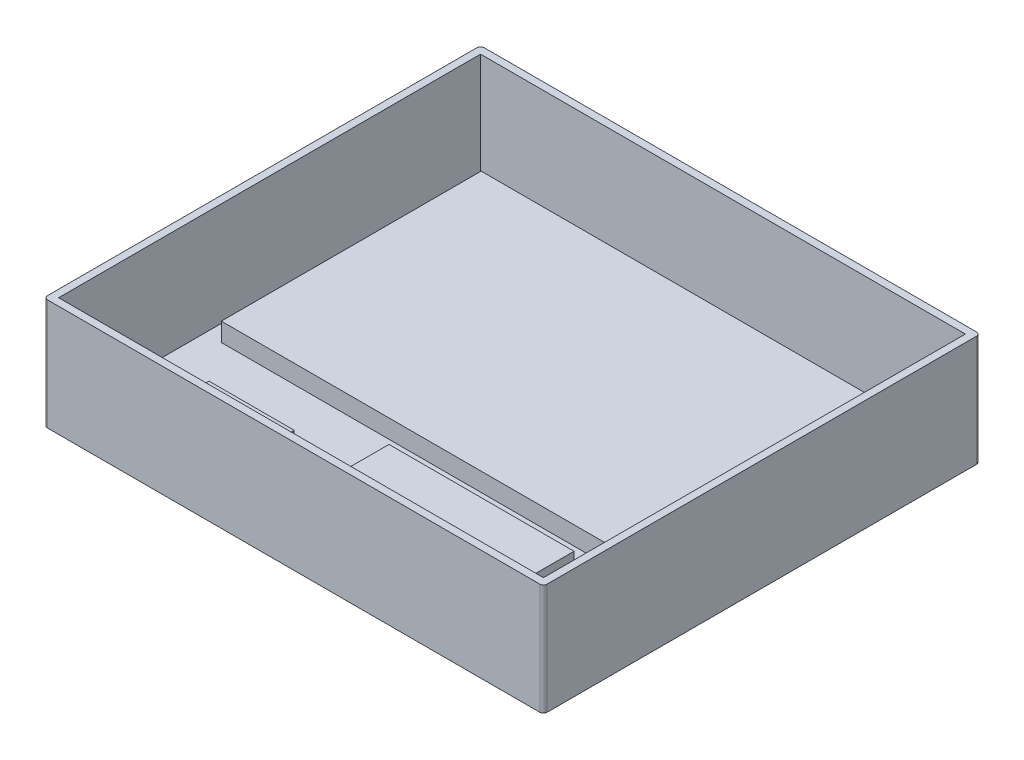
ISO-10303-21;
HEADER;
FILE_DESCRIPTION(('STEP AP214'),'2;1');
FILE_NAME('part.step','',(''),(''),'','','');
FILE_SCHEMA(('AUTOMOTIVE_DESIGN { 1 0 10303 214 1 1 1 1 }'));
ENDSEC;
DATA;
#1=APPLICATION_CONTEXT('core data for automotive mechanical design processes');
#2=APPLICATION_PROTOCOL_DEFINITION('international standard','automotive_design',2000,#1);
#3=PRODUCT_CONTEXT('',#1,'mechanical');
#4=PRODUCT('Part','Part','',(#3));
#5=PRODUCT_RELATED_PRODUCT_CATEGORY('part','',(#4));
#6=PRODUCT_DEFINITION_FORMATION('','',#4);
#7=PRODUCT_DEFINITION_CONTEXT('part definition',#1,'design');
#8=PRODUCT_DEFINITION('design','',#6,#7);
#9=PRODUCT_DEFINITION_SHAPE('','',#8);
#10=(LENGTH_UNIT() NAMED_UNIT(*) SI_UNIT(.MILLI.,.METRE.));
#11=(NAMED_UNIT(*) PLANE_ANGLE_UNIT() SI_UNIT($,.RADIAN.));
#12=(NAMED_UNIT(*) SI_UNIT($,.STERADIAN.) SOLID_ANGLE_UNIT());
#13=UNCERTAINTY_MEASURE_WITH_UNIT(LENGTH_MEASURE(1.E-05),#10,'distance_accuracy_value','');
#14=(GEOMETRIC_REPRESENTATION_CONTEXT(3) GLOBAL_UNCERTAINTY_ASSIGNED_CONTEXT((#13)) GLOBAL_UNIT_ASSIGNED_CONTEXT((#10,
#11,#12)) REPRESENTATION_CONTEXT('',''));
#15=CARTESIAN_POINT('',(0.,0.,0.));
#16=DIRECTION('',(0.,0.,1.));
#17=DIRECTION('',(1.,0.,0.));
#18=AXIS2_PLACEMENT_3D('',#15,#16,#17);
#19=CARTESIAN_POINT('',(-66.5,30.,-58.));
#20=DIRECTION('',(0.,-1.,0.));
#21=DIRECTION('',(0.,0.,-1.));
#22=AXIS2_PLACEMENT_3D('',#19,#20,#21);
#23=CYLINDRICAL_SURFACE('',#22,1.);
#24=DIRECTION('',(0.,-1.,0.));
#25=VECTOR('',#24,1.);
#26=CARTESIAN_POINT('',(-67.5,30.,-58.));
#27=LINE('',#26,#25);
#28=CARTESIAN_POINT('',(-67.5,30.,-58.));
#29=VERTEX_POINT('',#28);
#30=CARTESIAN_POINT('',(-67.5,0.,-58.));
#31=VERTEX_POINT('',#30);
#32=EDGE_CURVE('E443',#29,#31,#27,.T.);
#33=ORIENTED_EDGE('',*,*,#32,.F.);
#34=CARTESIAN_POINT('',(-66.5,30.,-58.));
#35=DIRECTION('',(0.,1.,0.));
#36=DIRECTION('',(0.,0.,1.));
#37=AXIS2_PLACEMENT_3D('',#34,#35,#36);
#38=CIRCLE('',#37,1.);
#39=CARTESIAN_POINT('',(-66.5,30.,-59.));
#40=VERTEX_POINT('',#39);
#41=EDGE_CURVE('E53',#40,#29,#38,.T.);
#42=ORIENTED_EDGE('',*,*,#41,.F.);
#43=DIRECTION('',(0.,-1.,0.));
#44=VECTOR('',#43,1.);
#45=CARTESIAN_POINT('',(-66.5,30.,-59.));
#46=LINE('',#45,#44);
#47=CARTESIAN_POINT('',(-66.5,0.,-59.));
#48=VERTEX_POINT('',#47);
#49=EDGE_CURVE('E447',#48,#40,#46,.F.);
#50=ORIENTED_EDGE('',*,*,#49,.F.);
#51=CARTESIAN_POINT('',(-66.5,0.,-58.));
#52=DIRECTION('',(0.,1.,0.));
#53=DIRECTION('',(0.,0.,1.));
#54=AXIS2_PLACEMENT_3D('',#51,#52,#53);
#55=CIRCLE('',#54,1.);
#56=EDGE_CURVE('E12',#31,#48,#55,.F.);
#57=ORIENTED_EDGE('',*,*,#56,.F.);
#58=EDGE_LOOP('',(#33,#42,#50,#57));
#59=FACE_BOUND('',#58,.T.);
#60=ADVANCED_FACE('F45',(#59),#23,.T.);
#61=CARTESIAN_POINT('',(66.5,30.,-58.));
#62=DIRECTION('',(0.,-1.,0.));
#63=DIRECTION('',(0.,0.,-1.));
#64=AXIS2_PLACEMENT_3D('',#61,#62,#63);
#65=CYLINDRICAL_SURFACE('',#64,1.);
#66=DIRECTION('',(0.,-1.,0.));
#67=VECTOR('',#66,1.);
#68=CARTESIAN_POINT('',(66.5,30.,-59.));
#69=LINE('',#68,#67);
#70=CARTESIAN_POINT('',(66.5,30.,-59.));
#71=VERTEX_POINT('',#70);
#72=CARTESIAN_POINT('',(66.5,0.,-59.));
#73=VERTEX_POINT('',#72);
#74=EDGE_CURVE('E429',#71,#73,#69,.T.);
#75=ORIENTED_EDGE('',*,*,#74,.F.);
#76=CARTESIAN_POINT('',(66.5,30.,-58.));
#77=DIRECTION('',(0.,1.,0.));
#78=DIRECTION('',(0.,0.,1.));
#79=AXIS2_PLACEMENT_3D('',#76,#77,#78);
#80=CIRCLE('',#79,1.);
#81=CARTESIAN_POINT('',(67.5,30.,-58.));
#82=VERTEX_POINT('',#81);
#83=EDGE_CURVE('E437',#82,#71,#80,.T.);
#84=ORIENTED_EDGE('',*,*,#83,.F.);
#85=DIRECTION('',(0.,-1.,0.));
#86=VECTOR('',#85,1.);
#87=CARTESIAN_POINT('',(67.5,30.,-58.));
#88=LINE('',#87,#86);
#89=CARTESIAN_POINT('',(67.5,0.,-58.));
#90=VERTEX_POINT('',#89);
#91=EDGE_CURVE('E433',#90,#82,#88,.F.);
#92=ORIENTED_EDGE('',*,*,#91,.F.);
#93=CARTESIAN_POINT('',(66.5,0.,-58.));
#94=DIRECTION('',(0.,1.,0.));
#95=DIRECTION('',(0.,0.,1.));
#96=AXIS2_PLACEMENT_3D('',#93,#94,#95);
#97=CIRCLE('',#96,1.);
#98=EDGE_CURVE('E440',#73,#90,#97,.F.);
#99=ORIENTED_EDGE('',*,*,#98,.F.);
#100=EDGE_LOOP('',(#75,#84,#92,#99));
#101=FACE_BOUND('',#100,.T.);
#102=ADVANCED_FACE('F476',(#101),#65,.T.);
#103=CARTESIAN_POINT('',(66.5,30.,58.));
#104=DIRECTION('',(0.,1.,0.));
#105=DIRECTION('',(0.,0.,1.));
#106=AXIS2_PLACEMENT_3D('',#103,#104,#105);
#107=CYLINDRICAL_SURFACE('',#106,1.);
#108=DIRECTION('',(0.,1.,0.));
#109=VECTOR('',#108,1.);
#110=CARTESIAN_POINT('',(66.5,30.,59.));
#111=LINE('',#110,#109);
#112=CARTESIAN_POINT('',(66.5,0.,59.));
#113=VERTEX_POINT('',#112);
#114=CARTESIAN_POINT('',(66.5,30.,59.));
#115=VERTEX_POINT('',#114);
#116=EDGE_CURVE('E415',#113,#115,#111,.T.);
#117=ORIENTED_EDGE('',*,*,#116,.F.);
#118=CARTESIAN_POINT('',(66.5,0.,58.));
#119=DIRECTION('',(0.,1.,0.));
#120=DIRECTION('',(0.,0.,1.));
#121=AXIS2_PLACEMENT_3D('',#118,#119,#120);
#122=CIRCLE('',#121,1.);
#123=CARTESIAN_POINT('',(67.5,0.,58.));
#124=VERTEX_POINT('',#123);
#125=EDGE_CURVE('E423',#124,#113,#122,.F.);
#126=ORIENTED_EDGE('',*,*,#125,.F.);
#127=DIRECTION('',(0.,1.,0.));
#128=VECTOR('',#127,1.);
#129=CARTESIAN_POINT('',(67.5,30.,58.));
#130=LINE('',#129,#128);
#131=CARTESIAN_POINT('',(67.5,30.,58.));
#132=VERTEX_POINT('',#131);
#133=EDGE_CURVE('E419',#132,#124,#130,.F.);
#134=ORIENTED_EDGE('',*,*,#133,.F.);
#135=CARTESIAN_POINT('',(66.5,30.,58.));
#136=DIRECTION('',(0.,1.,0.));
#137=DIRECTION('',(0.,0.,1.));
#138=AXIS2_PLACEMENT_3D('',#135,#136,#137);
#139=CIRCLE('',#138,1.);
#140=EDGE_CURVE('E426',#115,#132,#139,.T.);
#141=ORIENTED_EDGE('',*,*,#140,.F.);
#142=EDGE_LOOP('',(#117,#126,#134,#141));
#143=FACE_BOUND('',#142,.T.);
#144=ADVANCED_FACE('F468',(#143),#107,.T.);
#145=CARTESIAN_POINT('',(-66.5,30.,58.));
#146=DIRECTION('',(0.,1.,0.));
#147=DIRECTION('',(0.,0.,1.));
#148=AXIS2_PLACEMENT_3D('',#145,#146,#147);
#149=CYLINDRICAL_SURFACE('',#148,1.);
#150=DIRECTION('',(0.,1.,0.));
#151=VECTOR('',#150,1.);
#152=CARTESIAN_POINT('',(-67.5,30.,58.));
#153=LINE('',#152,#151);
#154=CARTESIAN_POINT('',(-67.5,0.,58.));
#155=VERTEX_POINT('',#154);
#156=CARTESIAN_POINT('',(-67.5,30.,58.));
#157=VERTEX_POINT('',#156);
#158=EDGE_CURVE('E387',#155,#157,#153,.T.);
#159=ORIENTED_EDGE('',*,*,#158,.F.);
#160=CARTESIAN_POINT('',(-66.5,0.,58.));
#161=DIRECTION('',(0.,1.,0.));
#162=DIRECTION('',(0.,0.,1.));
#163=AXIS2_PLACEMENT_3D('',#160,#161,#162);
#164=CIRCLE('',#163,1.);
#165=CARTESIAN_POINT('',(-66.5,0.,59.));
#166=VERTEX_POINT('',#165);
#167=EDGE_CURVE('E408',#166,#155,#164,.F.);
#168=ORIENTED_EDGE('',*,*,#167,.F.);
#169=DIRECTION('',(0.,1.,0.));
#170=VECTOR('',#169,1.);
#171=CARTESIAN_POINT('',(-66.5,30.,59.));
#172=LINE('',#171,#170);
#173=CARTESIAN_POINT('',(-66.5,30.,59.));
#174=VERTEX_POINT('',#173);
#175=EDGE_CURVE('E404',#174,#166,#172,.F.);
#176=ORIENTED_EDGE('',*,*,#175,.F.);
#177=CARTESIAN_POINT('',(-66.5,30.,58.));
#178=DIRECTION('',(0.,1.,0.));
#179=DIRECTION('',(0.,0.,1.));
#180=AXIS2_PLACEMENT_3D('',#177,#178,#179);
#181=CIRCLE('',#180,1.);
#182=EDGE_CURVE('E412',#157,#174,#181,.T.);
#183=ORIENTED_EDGE('',*,*,#182,.F.);
#184=EDGE_LOOP('',(#159,#168,#176,#183));
#185=FACE_BOUND('',#184,.T.);
#186=ADVANCED_FACE('F459',(#185),#149,.T.);
#187=CARTESIAN_POINT('',(0.,2.,0.));
#188=DIRECTION('',(0.,1.,0.));
#189=DIRECTION('',(0.,0.,1.));
#190=AXIS2_PLACEMENT_3D('',#187,#188,#189);
#191=PLANE('',#190);
#192=DIRECTION('',(0.,0.,-1.));
#193=VECTOR('',#192,1.);
#194=CARTESIAN_POINT('',(-65.5,2.,-57.));
#195=LINE('',#194,#193);
#196=CARTESIAN_POINT('',(-65.5,2.,57.));
#197=VERTEX_POINT('',#196);
#198=CARTESIAN_POINT('',(-65.5,2.,-57.));
#199=VERTEX_POINT('',#198);
#200=EDGE_CURVE('E338',#197,#199,#195,.T.);
#201=ORIENTED_EDGE('',*,*,#200,.F.);
#202=DIRECTION('',(-1.,0.,0.));
#203=VECTOR('',#202,1.);
#204=CARTESIAN_POINT('',(-65.5,2.,57.));
#205=LINE('',#204,#203);
#206=CARTESIAN_POINT('',(65.5,1.99999999999995,57.));
#207=VERTEX_POINT('',#206);
#208=EDGE_CURVE('E341',#207,#197,#205,.T.);
#209=ORIENTED_EDGE('',*,*,#208,.F.);
#210=DIRECTION('',(0.,0.,1.));
#211=VECTOR('',#210,1.);
#212=CARTESIAN_POINT('',(65.5,2.,-57.));
#213=LINE('',#212,#211);
#214=CARTESIAN_POINT('',(65.5,2.,-57.));
#215=VERTEX_POINT('',#214);
#216=EDGE_CURVE('E331',#215,#207,#213,.T.);
#217=ORIENTED_EDGE('',*,*,#216,.F.);
#218=DIRECTION('',(1.,0.,0.));
#219=VECTOR('',#218,1.);
#220=CARTESIAN_POINT('',(-65.5,2.,-57.));
#221=LINE('',#220,#219);
#222=EDGE_CURVE('E334',#199,#215,#221,.T.);
#223=ORIENTED_EDGE('',*,*,#222,.F.);
#224=EDGE_LOOP('',(#201,#209,#217,#223));
#225=FACE_BOUND('',#224,.T.);
#226=DIRECTION('',(1.,0.,0.));
#227=VECTOR('',#226,1.);
#228=CARTESIAN_POINT('',(-61.0431454583103,2.,17.4962222149236));
#229=LINE('',#228,#227);
#230=CARTESIAN_POINT('',(-61.0431454583103,2.,17.4962222149236));
#231=VERTEX_POINT('',#230);
#232=CARTESIAN_POINT('',(59.9568545416897,2.,17.4962222149236));
#233=VERTEX_POINT('',#232);
#234=EDGE_CURVE('E308',#231,#233,#229,.T.);
#235=ORIENTED_EDGE('',*,*,#234,.F.);
#236=DIRECTION('',(0.,0.,1.));
#237=VECTOR('',#236,1.);
#238=CARTESIAN_POINT('',(-61.0431454583103,2.,-52.7037777850764));
#239=LINE('',#238,#237);
#240=CARTESIAN_POINT('',(-61.0431454583103,2.,-52.7037777850764));
#241=VERTEX_POINT('',#240);
#242=EDGE_CURVE('E278',#241,#231,#239,.T.);
#243=ORIENTED_EDGE('',*,*,#242,.F.);
#244=DIRECTION('',(-1.,0.,0.));
#245=VECTOR('',#244,1.);
#246=CARTESIAN_POINT('',(-61.0431454583103,2.,-52.7037777850764));
#247=LINE('',#246,#245);
#248=CARTESIAN_POINT('',(59.9568545416897,2.,-52.7037777850764));
#249=VERTEX_POINT('',#248);
#250=EDGE_CURVE('E295',#249,#241,#247,.T.);
#251=ORIENTED_EDGE('',*,*,#250,.F.);
#252=DIRECTION('',(0.,0.,-1.));
#253=VECTOR('',#252,1.);
#254=CARTESIAN_POINT('',(59.9568545416897,2.,-52.7037777850764));
#255=LINE('',#254,#253);
#256=EDGE_CURVE('E311',#233,#249,#255,.T.);
#257=ORIENTED_EDGE('',*,*,#256,.F.);
#258=EDGE_LOOP('',(#235,#243,#251,#257));
#259=FACE_BOUND('',#258,.T.);
#260=DIRECTION('',(1.,0.,0.));
#261=VECTOR('',#260,1.);
#262=CARTESIAN_POINT('',(-48.6631036205587,2.,44.1895825385696));
#263=LINE('',#262,#261);
#264=CARTESIAN_POINT('',(-48.6631036205587,2.,44.1895825385696));
#265=VERTEX_POINT('',#264);
#266=CARTESIAN_POINT('',(-25.6631036205587,2.,44.1895825385696));
#267=VERTEX_POINT('',#266);
#268=EDGE_CURVE('E271',#265,#267,#263,.T.);
#269=ORIENTED_EDGE('',*,*,#268,.F.);
#270=DIRECTION('',(0.,0.,1.));
#271=VECTOR('',#270,1.);
#272=CARTESIAN_POINT('',(-48.6631036205587,2.,33.1895825385696));
#273=LINE('',#272,#271);
#274=CARTESIAN_POINT('',(-48.6631036205587,2.,33.1895825385696));
#275=VERTEX_POINT('',#274);
#276=EDGE_CURVE('E274',#275,#265,#273,.T.);
#277=ORIENTED_EDGE('',*,*,#276,.F.);
#278=DIRECTION('',(-1.,0.,0.));
#279=VECTOR('',#278,1.);
#280=CARTESIAN_POINT('',(-48.6631036205587,2.,33.1895825385696));
#281=LINE('',#280,#279);
#282=CARTESIAN_POINT('',(-25.6631036205587,2.,33.1895825385696));
#283=VERTEX_POINT('',#282);
#284=EDGE_CURVE('E263',#283,#275,#281,.T.);
#285=ORIENTED_EDGE('',*,*,#284,.F.);
#286=DIRECTION('',(0.,0.,-1.));
#287=VECTOR('',#286,1.);
#288=CARTESIAN_POINT('',(-25.6631036205587,2.,33.1895825385696));
#289=LINE('',#288,#287);
#290=EDGE_CURVE('E266',#267,#283,#289,.T.);
#291=ORIENTED_EDGE('',*,*,#290,.F.);
#292=EDGE_LOOP('',(#269,#277,#285,#291));
#293=FACE_BOUND('',#292,.T.);
#294=DIRECTION('',(1.,0.,0.));
#295=VECTOR('',#294,1.);
#296=CARTESIAN_POINT('',(-9.54404893751102,2.,53.6895825385696));
#297=LINE('',#296,#295);
#298=CARTESIAN_POINT('',(-9.54404893751102,2.,53.6895825385696));
#299=VERTEX_POINT('',#298);
#300=CARTESIAN_POINT('',(40.4559510624889,2.,53.6895825385695));
#301=VERTEX_POINT('',#300);
#302=EDGE_CURVE('E231',#299,#301,#297,.T.);
#303=ORIENTED_EDGE('',*,*,#302,.F.);
#304=DIRECTION('',(0.,0.,1.));
#305=VECTOR('',#304,1.);
#306=CARTESIAN_POINT('',(-9.54404893751105,2.,23.6895825385697));
#307=LINE('',#306,#305);
#308=CARTESIAN_POINT('',(-9.54404893751105,2.,23.6895825385697));
#309=VERTEX_POINT('',#308);
#310=EDGE_CURVE('E224',#309,#299,#307,.T.);
#311=ORIENTED_EDGE('',*,*,#310,.F.);
#312=DIRECTION('',(-1.,0.,0.));
#313=VECTOR('',#312,1.);
#314=CARTESIAN_POINT('',(-9.54404893751105,2.,23.6895825385697));
#315=LINE('',#314,#313);
#316=CARTESIAN_POINT('',(40.4559510624889,2.,23.6895825385695));
#317=VERTEX_POINT('',#316);
#318=EDGE_CURVE('E204',#317,#309,#315,.T.);
#319=ORIENTED_EDGE('',*,*,#318,.F.);
#320=DIRECTION('',(0.,0.,-1.));
#321=VECTOR('',#320,1.);
#322=CARTESIAN_POINT('',(40.4559510624889,2.,23.6895825385695));
#323=LINE('',#322,#321);
#324=EDGE_CURVE('E217',#301,#317,#323,.T.);
#325=ORIENTED_EDGE('',*,*,#324,.F.);
#326=EDGE_LOOP('',(#303,#311,#319,#325));
#327=FACE_BOUND('',#326,.T.);
#328=ADVANCED_FACE('F230',(#225,#259,#293,#327),#191,.T.);
#329=CARTESIAN_POINT('',(-67.5,30.,-59.));
#330=DIRECTION('',(1.,0.,0.));
#331=DIRECTION('',(0.,0.,-1.));
#332=AXIS2_PLACEMENT_3D('',#329,#330,#331);
#333=PLANE('',#332);
#334=DIRECTION('',(0.,0.,1.));
#335=VECTOR('',#334,1.);
#336=CARTESIAN_POINT('',(-67.5,30.,-59.));
#337=LINE('',#336,#335);
#338=EDGE_CURVE('E371',#29,#157,#337,.T.);
#339=ORIENTED_EDGE('',*,*,#338,.F.);
#340=ORIENTED_EDGE('',*,*,#32,.T.);
#341=DIRECTION('',(0.,0.,1.));
#342=VECTOR('',#341,1.);
#343=CARTESIAN_POINT('',(-67.5,0.,-59.));
#344=LINE('',#343,#342);
#345=EDGE_CURVE('E370',#31,#155,#344,.T.);
#346=ORIENTED_EDGE('',*,*,#345,.T.);
#347=ORIENTED_EDGE('',*,*,#158,.T.);
#348=EDGE_LOOP('',(#339,#340,#346,#347));
#349=FACE_BOUND('',#348,.T.);
#350=ADVANCED_FACE('F456',(#349),#333,.F.);
#351=CARTESIAN_POINT('',(-67.5,30.,59.));
#352=DIRECTION('',(0.,0.,-1.));
#353=DIRECTION('',(-1.,0.,0.));
#354=AXIS2_PLACEMENT_3D('',#351,#352,#353);
#355=PLANE('',#354);
#356=DIRECTION('',(1.,0.,0.));
#357=VECTOR('',#356,1.);
#358=CARTESIAN_POINT('',(-67.5,0.,59.));
#359=LINE('',#358,#357);
#360=EDGE_CURVE('E390',#166,#113,#359,.T.);
#361=ORIENTED_EDGE('',*,*,#360,.T.);
#362=ORIENTED_EDGE('',*,*,#116,.T.);
#363=DIRECTION('',(1.,0.,0.));
#364=VECTOR('',#363,1.);
#365=CARTESIAN_POINT('',(-67.5,30.,59.));
#366=LINE('',#365,#364);
#367=EDGE_CURVE('E374',#174,#115,#366,.T.);
#368=ORIENTED_EDGE('',*,*,#367,.F.);
#369=ORIENTED_EDGE('',*,*,#175,.T.);
#370=EDGE_LOOP('',(#361,#362,#368,#369));
#371=FACE_BOUND('',#370,.T.);
#372=ADVANCED_FACE('F464',(#371),#355,.F.);
#373=CARTESIAN_POINT('',(67.5,30.,-59.));
#374=DIRECTION('',(-1.,0.,0.));
#375=DIRECTION('',(0.,0.,1.));
#376=AXIS2_PLACEMENT_3D('',#373,#374,#375);
#377=PLANE('',#376);
#378=DIRECTION('',(0.,0.,-1.));
#379=VECTOR('',#378,1.);
#380=CARTESIAN_POINT('',(67.5,0.,-59.));
#381=LINE('',#380,#379);
#382=EDGE_CURVE('E394',#124,#90,#381,.T.);
#383=ORIENTED_EDGE('',*,*,#382,.T.);
#384=ORIENTED_EDGE('',*,*,#91,.T.);
#385=DIRECTION('',(0.,0.,-1.));
#386=VECTOR('',#385,1.);
#387=CARTESIAN_POINT('',(67.5,30.,-59.));
#388=LINE('',#387,#386);
#389=EDGE_CURVE('E379',#132,#82,#388,.T.);
#390=ORIENTED_EDGE('',*,*,#389,.F.);
#391=ORIENTED_EDGE('',*,*,#133,.T.);
#392=EDGE_LOOP('',(#383,#384,#390,#391));
#393=FACE_BOUND('',#392,.T.);
#394=ADVANCED_FACE('F472',(#393),#377,.F.);
#395=CARTESIAN_POINT('',(-67.5,30.,-59.));
#396=DIRECTION('',(0.,0.,1.));
#397=DIRECTION('',(1.,0.,0.));
#398=AXIS2_PLACEMENT_3D('',#395,#396,#397);
#399=PLANE('',#398);
#400=DIRECTION('',(-1.,0.,0.));
#401=VECTOR('',#400,1.);
#402=CARTESIAN_POINT('',(-67.5,0.,-59.));
#403=LINE('',#402,#401);
#404=EDGE_CURVE('E375',#73,#48,#403,.T.);
#405=ORIENTED_EDGE('',*,*,#404,.T.);
#406=ORIENTED_EDGE('',*,*,#49,.T.);
#407=DIRECTION('',(-1.,0.,0.));
#408=VECTOR('',#407,1.);
#409=CARTESIAN_POINT('',(-67.5,30.,-59.));
#410=LINE('',#409,#408);
#411=EDGE_CURVE('E383',#71,#40,#410,.T.);
#412=ORIENTED_EDGE('',*,*,#411,.F.);
#413=ORIENTED_EDGE('',*,*,#74,.T.);
#414=EDGE_LOOP('',(#405,#406,#412,#413));
#415=FACE_BOUND('',#414,.T.);
#416=ADVANCED_FACE('F478',(#415),#399,.F.);
#417=CARTESIAN_POINT('',(0.,30.,0.));
#418=DIRECTION('',(0.,1.,0.));
#419=DIRECTION('',(0.,0.,1.));
#420=AXIS2_PLACEMENT_3D('',#417,#418,#419);
#421=PLANE('',#420);
#422=DIRECTION('',(0.,0.,1.));
#423=VECTOR('',#422,1.);
#424=CARTESIAN_POINT('',(-65.5,30.,-57.));
#425=LINE('',#424,#423);
#426=CARTESIAN_POINT('',(-65.5,30.,-57.));
#427=VERTEX_POINT('',#426);
#428=CARTESIAN_POINT('',(-65.5,30.,57.));
#429=VERTEX_POINT('',#428);
#430=EDGE_CURVE('E330',#427,#429,#425,.T.);
#431=ORIENTED_EDGE('',*,*,#430,.F.);
#432=DIRECTION('',(-1.,0.,0.));
#433=VECTOR('',#432,1.);
#434=CARTESIAN_POINT('',(-65.5,30.,-57.));
#435=LINE('',#434,#433);
#436=CARTESIAN_POINT('',(65.5,30.,-57.));
#437=VERTEX_POINT('',#436);
#438=EDGE_CURVE('E352',#437,#427,#435,.T.);
#439=ORIENTED_EDGE('',*,*,#438,.F.);
#440=DIRECTION('',(0.,0.,-1.));
#441=VECTOR('',#440,1.);
#442=CARTESIAN_POINT('',(65.5,30.,-57.));
#443=LINE('',#442,#441);
#444=CARTESIAN_POINT('',(65.5,30.,57.));
#445=VERTEX_POINT('',#444);
#446=EDGE_CURVE('E348',#445,#437,#443,.T.);
#447=ORIENTED_EDGE('',*,*,#446,.F.);
#448=DIRECTION('',(1.,0.,0.));
#449=VECTOR('',#448,1.);
#450=CARTESIAN_POINT('',(-65.5,30.,57.));
#451=LINE('',#450,#449);
#452=EDGE_CURVE('E344',#429,#445,#451,.T.);
#453=ORIENTED_EDGE('',*,*,#452,.F.);
#454=EDGE_LOOP('',(#431,#439,#447,#453));
#455=FACE_BOUND('',#454,.T.);
#456=ORIENTED_EDGE('',*,*,#411,.T.);
#457=ORIENTED_EDGE('',*,*,#41,.T.);
#458=ORIENTED_EDGE('',*,*,#338,.T.);
#459=ORIENTED_EDGE('',*,*,#182,.T.);
#460=ORIENTED_EDGE('',*,*,#367,.T.);
#461=ORIENTED_EDGE('',*,*,#140,.T.);
#462=ORIENTED_EDGE('',*,*,#389,.T.);
#463=ORIENTED_EDGE('',*,*,#83,.T.);
#464=EDGE_LOOP('',(#456,#457,#458,#459,#460,#461,#462,#463));
#465=FACE_BOUND('',#464,.T.);
#466=ADVANCED_FACE('F451',(#455,#465),#421,.T.);
#467=CARTESIAN_POINT('',(0.,0.,0.));
#468=DIRECTION('',(0.,1.,0.));
#469=DIRECTION('',(0.,0.,1.));
#470=AXIS2_PLACEMENT_3D('',#467,#468,#469);
#471=PLANE('',#470);
#472=ORIENTED_EDGE('',*,*,#345,.F.);
#473=ORIENTED_EDGE('',*,*,#56,.T.);
#474=ORIENTED_EDGE('',*,*,#404,.F.);
#475=ORIENTED_EDGE('',*,*,#98,.T.);
#476=ORIENTED_EDGE('',*,*,#382,.F.);
#477=ORIENTED_EDGE('',*,*,#125,.T.);
#478=ORIENTED_EDGE('',*,*,#360,.F.);
#479=ORIENTED_EDGE('',*,*,#167,.T.);
#480=EDGE_LOOP('',(#472,#473,#474,#475,#476,#477,#478,#479));
#481=FACE_BOUND('',#480,.T.);
#482=ADVANCED_FACE('F479',(#481),#471,.F.);
#483=CARTESIAN_POINT('',(-65.5,-199.657709301948,-57.));
#484=DIRECTION('',(-1.,0.,0.));
#485=DIRECTION('',(0.,0.,1.));
#486=AXIS2_PLACEMENT_3D('',#483,#484,#485);
#487=PLANE('',#486);
#488=ORIENTED_EDGE('',*,*,#200,.T.);
#489=DIRECTION('',(0.,1.,0.));
#490=VECTOR('',#489,1.);
#491=CARTESIAN_POINT('',(-65.5,-199.657709301948,-57.));
#492=LINE('',#491,#490);
#493=EDGE_CURVE('E335',#199,#427,#492,.T.);
#494=ORIENTED_EDGE('',*,*,#493,.T.);
#495=ORIENTED_EDGE('',*,*,#430,.T.);
#496=DIRECTION('',(0.,1.,0.));
#497=VECTOR('',#496,1.);
#498=CARTESIAN_POINT('',(-65.5,-199.657709301948,57.));
#499=LINE('',#498,#497);
#500=EDGE_CURVE('E356',#197,#429,#499,.T.);
#501=ORIENTED_EDGE('',*,*,#500,.F.);
#502=EDGE_LOOP('',(#488,#494,#495,#501));
#503=FACE_BOUND('',#502,.T.);
#504=ADVANCED_FACE('F481',(#503),#487,.F.);
#505=CARTESIAN_POINT('',(-65.5,-199.657709301948,-57.));
#506=DIRECTION('',(0.,0.,-1.));
#507=DIRECTION('',(-1.,0.,0.));
#508=AXIS2_PLACEMENT_3D('',#505,#506,#507);
#509=PLANE('',#508);
#510=ORIENTED_EDGE('',*,*,#222,.T.);
#511=DIRECTION('',(0.,1.,0.));
#512=VECTOR('',#511,1.);
#513=CARTESIAN_POINT('',(65.5,-199.657709301948,-57.));
#514=LINE('',#513,#512);
#515=EDGE_CURVE('E359',#215,#437,#514,.T.);
#516=ORIENTED_EDGE('',*,*,#515,.T.);
#517=ORIENTED_EDGE('',*,*,#438,.T.);
#518=ORIENTED_EDGE('',*,*,#493,.F.);
#519=EDGE_LOOP('',(#510,#516,#517,#518));
#520=FACE_BOUND('',#519,.T.);
#521=ADVANCED_FACE('F487',(#520),#509,.F.);
#522=CARTESIAN_POINT('',(65.5,-199.657709301948,-57.));
#523=DIRECTION('',(1.,0.,0.));
#524=DIRECTION('',(0.,0.,-1.));
#525=AXIS2_PLACEMENT_3D('',#522,#523,#524);
#526=PLANE('',#525);
#527=ORIENTED_EDGE('',*,*,#216,.T.);
#528=DIRECTION('',(0.,1.,0.));
#529=VECTOR('',#528,1.);
#530=CARTESIAN_POINT('',(65.5,-199.657709301948,57.));
#531=LINE('',#530,#529);
#532=EDGE_CURVE('E362',#207,#445,#531,.T.);
#533=ORIENTED_EDGE('',*,*,#532,.T.);
#534=ORIENTED_EDGE('',*,*,#446,.T.);
#535=ORIENTED_EDGE('',*,*,#515,.F.);
#536=EDGE_LOOP('',(#527,#533,#534,#535));
#537=FACE_BOUND('',#536,.T.);
#538=ADVANCED_FACE('F544',(#537),#526,.F.);
#539=CARTESIAN_POINT('',(-65.5,-199.657709301948,57.));
#540=DIRECTION('',(0.,0.,1.));
#541=DIRECTION('',(1.,0.,0.));
#542=AXIS2_PLACEMENT_3D('',#539,#540,#541);
#543=PLANE('',#542);
#544=ORIENTED_EDGE('',*,*,#208,.T.);
#545=ORIENTED_EDGE('',*,*,#500,.T.);
#546=ORIENTED_EDGE('',*,*,#452,.T.);
#547=ORIENTED_EDGE('',*,*,#532,.F.);
#548=EDGE_LOOP('',(#544,#545,#546,#547));
#549=FACE_BOUND('',#548,.T.);
#550=ADVANCED_FACE('F555',(#549),#543,.F.);
#551=CARTESIAN_POINT('',(-61.0431454583103,7.,-52.7037777850764));
#552=DIRECTION('',(1.,0.,0.));
#553=DIRECTION('',(0.,0.,-1.));
#554=AXIS2_PLACEMENT_3D('',#551,#552,#553);
#555=PLANE('',#554);
#556=ORIENTED_EDGE('',*,*,#242,.T.);
#557=DIRECTION('',(0.,-1.,0.));
#558=VECTOR('',#557,1.);
#559=CARTESIAN_POINT('',(-61.0431454583103,7.,17.4962222149236));
#560=LINE('',#559,#558);
#561=CARTESIAN_POINT('',(-61.0431454583103,7.,17.4962222149236));
#562=VERTEX_POINT('',#561);
#563=EDGE_CURVE('E327',#562,#231,#560,.T.);
#564=ORIENTED_EDGE('',*,*,#563,.F.);
#565=DIRECTION('',(0.,0.,1.));
#566=VECTOR('',#565,1.);
#567=CARTESIAN_POINT('',(-61.0431454583103,7.,-52.7037777850764));
#568=LINE('',#567,#566);
#569=CARTESIAN_POINT('',(-61.0431454583103,7.,-52.7037777850764));
#570=VERTEX_POINT('',#569);
#571=EDGE_CURVE('E290',#570,#562,#568,.T.);
#572=ORIENTED_EDGE('',*,*,#571,.F.);
#573=DIRECTION('',(0.,-1.,0.));
#574=VECTOR('',#573,1.);
#575=CARTESIAN_POINT('',(-61.0431454583103,7.,-52.7037777850764));
#576=LINE('',#575,#574);
#577=EDGE_CURVE('E304',#570,#241,#576,.T.);
#578=ORIENTED_EDGE('',*,*,#577,.T.);
#579=EDGE_LOOP('',(#556,#564,#572,#578));
#580=FACE_BOUND('',#579,.T.);
#581=ADVANCED_FACE('F566',(#580),#555,.F.);
#582=CARTESIAN_POINT('',(-61.0431454583103,7.,17.4962222149236));
#583=DIRECTION('',(0.,0.,-1.));
#584=DIRECTION('',(-1.,0.,0.));
#585=AXIS2_PLACEMENT_3D('',#582,#583,#584);
#586=PLANE('',#585);
#587=ORIENTED_EDGE('',*,*,#234,.T.);
#588=DIRECTION('',(0.,-1.,0.));
#589=VECTOR('',#588,1.);
#590=CARTESIAN_POINT('',(59.9568545416897,7.,17.4962222149236));
#591=LINE('',#590,#589);
#592=CARTESIAN_POINT('',(59.9568545416897,7.,17.4962222149236));
#593=VERTEX_POINT('',#592);
#594=EDGE_CURVE('E323',#593,#233,#591,.T.);
#595=ORIENTED_EDGE('',*,*,#594,.F.);
#596=DIRECTION('',(1.,0.,0.));
#597=VECTOR('',#596,1.);
#598=CARTESIAN_POINT('',(-61.0431454583103,7.,17.4962222149236));
#599=LINE('',#598,#597);
#600=EDGE_CURVE('E294',#562,#593,#599,.T.);
#601=ORIENTED_EDGE('',*,*,#600,.F.);
#602=ORIENTED_EDGE('',*,*,#563,.T.);
#603=EDGE_LOOP('',(#587,#595,#601,#602));
#604=FACE_BOUND('',#603,.T.);
#605=ADVANCED_FACE('F586',(#604),#586,.F.);
#606=CARTESIAN_POINT('',(59.9568545416897,7.,-52.7037777850764));
#607=DIRECTION('',(-1.,0.,0.));
#608=DIRECTION('',(0.,0.,1.));
#609=AXIS2_PLACEMENT_3D('',#606,#607,#608);
#610=PLANE('',#609);
#611=ORIENTED_EDGE('',*,*,#256,.T.);
#612=DIRECTION('',(0.,-1.,0.));
#613=VECTOR('',#612,1.);
#614=CARTESIAN_POINT('',(59.9568545416897,7.,-52.7037777850764));
#615=LINE('',#614,#613);
#616=CARTESIAN_POINT('',(59.9568545416897,7.,-52.7037777850764));
#617=VERTEX_POINT('',#616);
#618=EDGE_CURVE('E320',#617,#249,#615,.T.);
#619=ORIENTED_EDGE('',*,*,#618,.F.);
#620=DIRECTION('',(0.,0.,-1.));
#621=VECTOR('',#620,1.);
#622=CARTESIAN_POINT('',(59.9568545416897,7.,-52.7037777850764));
#623=LINE('',#622,#621);
#624=EDGE_CURVE('E298',#593,#617,#623,.T.);
#625=ORIENTED_EDGE('',*,*,#624,.F.);
#626=ORIENTED_EDGE('',*,*,#594,.T.);
#627=EDGE_LOOP('',(#611,#619,#625,#626));
#628=FACE_BOUND('',#627,.T.);
#629=ADVANCED_FACE('F597',(#628),#610,.F.);
#630=CARTESIAN_POINT('',(-61.0431454583103,7.,-52.7037777850764));
#631=DIRECTION('',(0.,0.,1.));
#632=DIRECTION('',(1.,0.,0.));
#633=AXIS2_PLACEMENT_3D('',#630,#631,#632);
#634=PLANE('',#633);
#635=ORIENTED_EDGE('',*,*,#250,.T.);
#636=ORIENTED_EDGE('',*,*,#577,.F.);
#637=DIRECTION('',(-1.,0.,0.));
#638=VECTOR('',#637,1.);
#639=CARTESIAN_POINT('',(-61.0431454583103,7.,-52.7037777850764));
#640=LINE('',#639,#638);
#641=EDGE_CURVE('E301',#617,#570,#640,.T.);
#642=ORIENTED_EDGE('',*,*,#641,.F.);
#643=ORIENTED_EDGE('',*,*,#618,.T.);
#644=EDGE_LOOP('',(#635,#636,#642,#643));
#645=FACE_BOUND('',#644,.T.);
#646=ADVANCED_FACE('F608',(#645),#634,.F.);
#647=CARTESIAN_POINT('',(0.,7.,0.));
#648=DIRECTION('',(0.,1.,0.));
#649=DIRECTION('',(0.,0.,1.));
#650=AXIS2_PLACEMENT_3D('',#647,#648,#649);
#651=PLANE('',#650);
#652=ORIENTED_EDGE('',*,*,#571,.T.);
#653=ORIENTED_EDGE('',*,*,#600,.T.);
#654=ORIENTED_EDGE('',*,*,#624,.T.);
#655=ORIENTED_EDGE('',*,*,#641,.T.);
#656=EDGE_LOOP('',(#652,#653,#654,#655));
#657=FACE_BOUND('',#656,.T.);
#658=ADVANCED_FACE('F619',(#657),#651,.T.);
#659=CARTESIAN_POINT('',(-48.6631036205587,7.,33.1895825385696));
#660=DIRECTION('',(1.,0.,0.));
#661=DIRECTION('',(0.,0.,-1.));
#662=AXIS2_PLACEMENT_3D('',#659,#660,#661);
#663=PLANE('',#662);
#664=ORIENTED_EDGE('',*,*,#276,.T.);
#665=DIRECTION('',(0.,-1.,0.));
#666=VECTOR('',#665,1.);
#667=CARTESIAN_POINT('',(-48.6631036205587,7.,44.1895825385696));
#668=LINE('',#667,#666);
#669=CARTESIAN_POINT('',(-48.6631036205587,7.,44.1895825385696));
#670=VERTEX_POINT('',#669);
#671=EDGE_CURVE('E233',#670,#265,#668,.T.);
#672=ORIENTED_EDGE('',*,*,#671,.F.);
#673=DIRECTION('',(0.,0.,1.));
#674=VECTOR('',#673,1.);
#675=CARTESIAN_POINT('',(-48.6631036205587,7.,33.1895825385696));
#676=LINE('',#675,#674);
#677=CARTESIAN_POINT('',(-48.6631036205587,7.,33.1895825385696));
#678=VERTEX_POINT('',#677);
#679=EDGE_CURVE('E267',#678,#670,#676,.T.);
#680=ORIENTED_EDGE('',*,*,#679,.F.);
#681=DIRECTION('',(0.,-1.,0.));
#682=VECTOR('',#681,1.);
#683=CARTESIAN_POINT('',(-48.6631036205587,7.,33.1895825385696));
#684=LINE('',#683,#682);
#685=EDGE_CURVE('E258',#678,#275,#684,.T.);
#686=ORIENTED_EDGE('',*,*,#685,.T.);
#687=EDGE_LOOP('',(#664,#672,#680,#686));
#688=FACE_BOUND('',#687,.T.);
#689=ADVANCED_FACE('F630',(#688),#663,.F.);
#690=CARTESIAN_POINT('',(-48.6631036205587,7.,44.1895825385696));
#691=DIRECTION('',(0.,0.,-1.));
#692=DIRECTION('',(-1.,0.,0.));
#693=AXIS2_PLACEMENT_3D('',#690,#691,#692);
#694=PLANE('',#693);
#695=ORIENTED_EDGE('',*,*,#268,.T.);
#696=DIRECTION('',(0.,-1.,0.));
#697=VECTOR('',#696,1.);
#698=CARTESIAN_POINT('',(-25.6631036205587,7.,44.1895825385696));
#699=LINE('',#698,#697);
#700=CARTESIAN_POINT('',(-25.6631036205587,7.,44.1895825385696));
#701=VERTEX_POINT('',#700);
#702=EDGE_CURVE('E237',#701,#267,#699,.T.);
#703=ORIENTED_EDGE('',*,*,#702,.F.);
#704=DIRECTION('',(1.,0.,0.));
#705=VECTOR('',#704,1.);
#706=CARTESIAN_POINT('',(-48.6631036205587,7.,44.1895825385696));
#707=LINE('',#706,#705);
#708=EDGE_CURVE('E284',#670,#701,#707,.T.);
#709=ORIENTED_EDGE('',*,*,#708,.F.);
#710=ORIENTED_EDGE('',*,*,#671,.T.);
#711=EDGE_LOOP('',(#695,#703,#709,#710));
#712=FACE_BOUND('',#711,.T.);
#713=ADVANCED_FACE('F641',(#712),#694,.F.);
#714=CARTESIAN_POINT('',(-25.6631036205587,7.,33.1895825385696));
#715=DIRECTION('',(-1.,0.,0.));
#716=DIRECTION('',(0.,0.,1.));
#717=AXIS2_PLACEMENT_3D('',#714,#715,#716);
#718=PLANE('',#717);
#719=ORIENTED_EDGE('',*,*,#290,.T.);
#720=DIRECTION('',(0.,-1.,0.));
#721=VECTOR('',#720,1.);
#722=CARTESIAN_POINT('',(-25.6631036205587,7.,33.1895825385696));
#723=LINE('',#722,#721);
#724=CARTESIAN_POINT('',(-25.6631036205587,7.,33.1895825385696));
#725=VERTEX_POINT('',#724);
#726=EDGE_CURVE('E255',#725,#283,#723,.T.);
#727=ORIENTED_EDGE('',*,*,#726,.F.);
#728=DIRECTION('',(0.,0.,-1.));
#729=VECTOR('',#728,1.);
#730=CARTESIAN_POINT('',(-25.6631036205587,7.,33.1895825385696));
#731=LINE('',#730,#729);
#732=EDGE_CURVE('E281',#701,#725,#731,.T.);
#733=ORIENTED_EDGE('',*,*,#732,.F.);
#734=ORIENTED_EDGE('',*,*,#702,.T.);
#735=EDGE_LOOP('',(#719,#727,#733,#734));
#736=FACE_BOUND('',#735,.T.);
#737=ADVANCED_FACE('F652',(#736),#718,.F.);
#738=CARTESIAN_POINT('',(-48.6631036205587,7.,33.1895825385696));
#739=DIRECTION('',(0.,0.,1.));
#740=DIRECTION('',(1.,0.,0.));
#741=AXIS2_PLACEMENT_3D('',#738,#739,#740);
#742=PLANE('',#741);
#743=ORIENTED_EDGE('',*,*,#284,.T.);
#744=ORIENTED_EDGE('',*,*,#685,.F.);
#745=DIRECTION('',(-1.,0.,0.));
#746=VECTOR('',#745,1.);
#747=CARTESIAN_POINT('',(-48.6631036205587,7.,33.1895825385696));
#748=LINE('',#747,#746);
#749=EDGE_CURVE('E262',#725,#678,#748,.T.);
#750=ORIENTED_EDGE('',*,*,#749,.F.);
#751=ORIENTED_EDGE('',*,*,#726,.T.);
#752=EDGE_LOOP('',(#743,#744,#750,#751));
#753=FACE_BOUND('',#752,.T.);
#754=ADVANCED_FACE('F663',(#753),#742,.F.);
#755=CARTESIAN_POINT('',(0.,7.,0.));
#756=DIRECTION('',(0.,1.,0.));
#757=DIRECTION('',(0.,0.,1.));
#758=AXIS2_PLACEMENT_3D('',#755,#756,#757);
#759=PLANE('',#758);
#760=ORIENTED_EDGE('',*,*,#679,.T.);
#761=ORIENTED_EDGE('',*,*,#708,.T.);
#762=ORIENTED_EDGE('',*,*,#732,.T.);
#763=ORIENTED_EDGE('',*,*,#749,.T.);
#764=EDGE_LOOP('',(#760,#761,#762,#763));
#765=FACE_BOUND('',#764,.T.);
#766=ADVANCED_FACE('F674',(#765),#759,.T.);
#767=CARTESIAN_POINT('',(-9.54404893751105,7.,23.6895825385697));
#768=DIRECTION('',(1.,0.,0.));
#769=DIRECTION('',(0.,0.,-1.));
#770=AXIS2_PLACEMENT_3D('',#767,#768,#769);
#771=PLANE('',#770);
#772=ORIENTED_EDGE('',*,*,#310,.T.);
#773=DIRECTION('',(0.,-1.,0.));
#774=VECTOR('',#773,1.);
#775=CARTESIAN_POINT('',(-9.54404893751102,7.,53.6895825385696));
#776=LINE('',#775,#774);
#777=CARTESIAN_POINT('',(-9.54404893751102,7.,53.6895825385696));
#778=VERTEX_POINT('',#777);
#779=EDGE_CURVE('E815',#778,#299,#776,.T.);
#780=ORIENTED_EDGE('',*,*,#779,.F.);
#781=DIRECTION('',(0.,0.,1.));
#782=VECTOR('',#781,1.);
#783=CARTESIAN_POINT('',(-9.54404893751105,7.,23.6895825385697));
#784=LINE('',#783,#782);
#785=CARTESIAN_POINT('',(-9.54404893751105,7.,23.6895825385697));
#786=VERTEX_POINT('',#785);
#787=EDGE_CURVE('E218',#786,#778,#784,.T.);
#788=ORIENTED_EDGE('',*,*,#787,.F.);
#789=DIRECTION('',(0.,-1.,0.));
#790=VECTOR('',#789,1.);
#791=CARTESIAN_POINT('',(-9.54404893751105,7.,23.6895825385697));
#792=LINE('',#791,#790);
#793=EDGE_CURVE('E208',#786,#309,#792,.T.);
#794=ORIENTED_EDGE('',*,*,#793,.T.);
#795=EDGE_LOOP('',(#772,#780,#788,#794));
#796=FACE_BOUND('',#795,.T.);
#797=ADVANCED_FACE('F222',(#796),#771,.F.);
#798=CARTESIAN_POINT('',(-9.54404893751102,7.,53.6895825385696));
#799=DIRECTION('',(0.,0.,-1.));
#800=DIRECTION('',(-1.,0.,0.));
#801=AXIS2_PLACEMENT_3D('',#798,#799,#800);
#802=PLANE('',#801);
#803=ORIENTED_EDGE('',*,*,#302,.T.);
#804=DIRECTION('',(0.,-1.,0.));
#805=VECTOR('',#804,1.);
#806=CARTESIAN_POINT('',(40.4559510624889,7.,53.6895825385695));
#807=LINE('',#806,#805);
#808=CARTESIAN_POINT('',(40.4559510624889,7.,53.6895825385695));
#809=VERTEX_POINT('',#808);
#810=EDGE_CURVE('E817',#809,#301,#807,.T.);
#811=ORIENTED_EDGE('',*,*,#810,.F.);
#812=DIRECTION('',(1.,0.,0.));
#813=VECTOR('',#812,1.);
#814=CARTESIAN_POINT('',(-9.54404893751102,7.,53.6895825385696));
#815=LINE('',#814,#813);
#816=EDGE_CURVE('E247',#778,#809,#815,.T.);
#817=ORIENTED_EDGE('',*,*,#816,.F.);
#818=ORIENTED_EDGE('',*,*,#779,.T.);
#819=EDGE_LOOP('',(#803,#811,#817,#818));
#820=FACE_BOUND('',#819,.T.);
#821=ADVANCED_FACE('F695',(#820),#802,.F.);
#822=CARTESIAN_POINT('',(40.4559510624889,7.,23.6895825385695));
#823=DIRECTION('',(-1.,0.,0.));
#824=DIRECTION('',(0.,0.,1.));
#825=AXIS2_PLACEMENT_3D('',#822,#823,#824);
#826=PLANE('',#825);
#827=ORIENTED_EDGE('',*,*,#324,.T.);
#828=DIRECTION('',(0.,-1.,0.));
#829=VECTOR('',#828,1.);
#830=CARTESIAN_POINT('',(40.4559510624889,7.,23.6895825385695));
#831=LINE('',#830,#829);
#832=CARTESIAN_POINT('',(40.4559510624889,7.,23.6895825385695));
#833=VERTEX_POINT('',#832);
#834=EDGE_CURVE('E211',#833,#317,#831,.T.);
#835=ORIENTED_EDGE('',*,*,#834,.F.);
#836=DIRECTION('',(0.,0.,-1.));
#837=VECTOR('',#836,1.);
#838=CARTESIAN_POINT('',(40.4559510624889,7.,23.6895825385695));
#839=LINE('',#838,#837);
#840=EDGE_CURVE('E244',#809,#833,#839,.T.);
#841=ORIENTED_EDGE('',*,*,#840,.F.);
#842=ORIENTED_EDGE('',*,*,#810,.T.);
#843=EDGE_LOOP('',(#827,#835,#841,#842));
#844=FACE_BOUND('',#843,.T.);
#845=ADVANCED_FACE('F705',(#844),#826,.F.);
#846=CARTESIAN_POINT('',(-9.54404893751105,7.,23.6895825385697));
#847=DIRECTION('',(0.,0.,1.));
#848=DIRECTION('',(1.,0.,0.));
#849=AXIS2_PLACEMENT_3D('',#846,#847,#848);
#850=PLANE('',#849);
#851=ORIENTED_EDGE('',*,*,#318,.T.);
#852=ORIENTED_EDGE('',*,*,#793,.F.);
#853=DIRECTION('',(-1.,0.,0.));
#854=VECTOR('',#853,1.);
#855=CARTESIAN_POINT('',(-9.54404893751105,7.,23.6895825385697));
#856=LINE('',#855,#854);
#857=EDGE_CURVE('E228',#833,#786,#856,.T.);
#858=ORIENTED_EDGE('',*,*,#857,.F.);
#859=ORIENTED_EDGE('',*,*,#834,.T.);
#860=EDGE_LOOP('',(#851,#852,#858,#859));
#861=FACE_BOUND('',#860,.T.);
#862=ADVANCED_FACE('F206',(#861),#850,.F.);
#863=CARTESIAN_POINT('',(0.,7.,0.));
#864=DIRECTION('',(0.,1.,0.));
#865=DIRECTION('',(0.,0.,1.));
#866=AXIS2_PLACEMENT_3D('',#863,#864,#865);
#867=PLANE('',#866);
#868=ORIENTED_EDGE('',*,*,#787,.T.);
#869=ORIENTED_EDGE('',*,*,#816,.T.);
#870=ORIENTED_EDGE('',*,*,#840,.T.);
#871=ORIENTED_EDGE('',*,*,#857,.T.);
#872=EDGE_LOOP('',(#868,#869,#870,#871));
#873=FACE_BOUND('',#872,.T.);
#874=ADVANCED_FACE('F726',(#873),#867,.T.);
#875=CLOSED_SHELL('',(#60,#102,#144,#186,#328,#350,#372,#394,#416,#466,#482,#504,#521,#538,#550,
#581,#605,#629,#646,#658,#689,#713,#737,#754,#766,#797,#821,#845,#862,#874));
#876=MANIFOLD_SOLID_BREP('B2',#875);
#877=ADVANCED_BREP_SHAPE_REPRESENTATION('',(#18,#876),#14);
#878=SHAPE_DEFINITION_REPRESENTATION(#9,#877);
ENDSEC;
END-ISO-10303-21;
